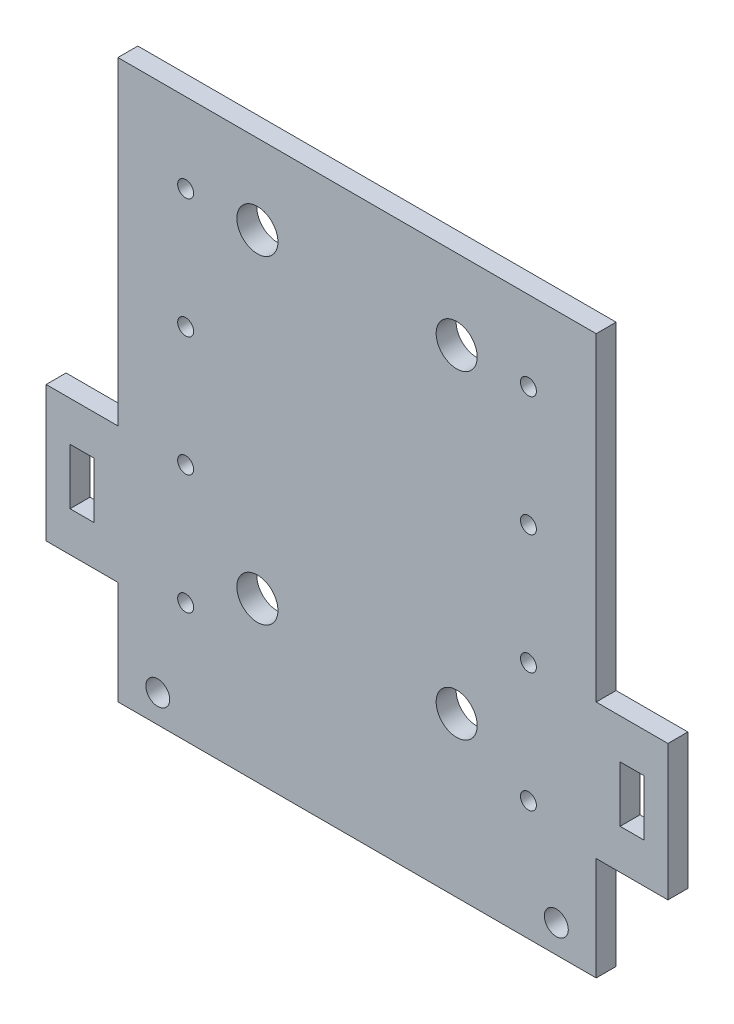
ISO-10303-21;
HEADER;
FILE_DESCRIPTION(('STEP AP214'),'2;1');
FILE_NAME('part.step','',(''),(''),'','','');
FILE_SCHEMA(('AUTOMOTIVE_DESIGN { 1 0 10303 214 1 1 1 1 }'));
ENDSEC;
DATA;
#1=APPLICATION_CONTEXT('core data for automotive mechanical design processes');
#2=APPLICATION_PROTOCOL_DEFINITION('international standard','automotive_design',2000,#1);
#3=PRODUCT_CONTEXT('',#1,'mechanical');
#4=PRODUCT('Part','Part','',(#3));
#5=PRODUCT_RELATED_PRODUCT_CATEGORY('part','',(#4));
#6=PRODUCT_DEFINITION_FORMATION('','',#4);
#7=PRODUCT_DEFINITION_CONTEXT('part definition',#1,'design');
#8=PRODUCT_DEFINITION('design','',#6,#7);
#9=PRODUCT_DEFINITION_SHAPE('','',#8);
#10=(LENGTH_UNIT() NAMED_UNIT(*) SI_UNIT(.MILLI.,.METRE.));
#11=(NAMED_UNIT(*) PLANE_ANGLE_UNIT() SI_UNIT($,.RADIAN.));
#12=(NAMED_UNIT(*) SI_UNIT($,.STERADIAN.) SOLID_ANGLE_UNIT());
#13=UNCERTAINTY_MEASURE_WITH_UNIT(LENGTH_MEASURE(1.E-05),#10,'distance_accuracy_value','');
#14=(GEOMETRIC_REPRESENTATION_CONTEXT(3) GLOBAL_UNCERTAINTY_ASSIGNED_CONTEXT((#13)) GLOBAL_UNIT_ASSIGNED_CONTEXT((#10,
#11,#12)) REPRESENTATION_CONTEXT('',''));
#15=CARTESIAN_POINT('',(0.,0.,0.));
#16=DIRECTION('',(0.,0.,1.));
#17=DIRECTION('',(1.,0.,0.));
#18=AXIS2_PLACEMENT_3D('',#15,#16,#17);
#19=CARTESIAN_POINT('',(-54.6061488794653,570.344470221386,0.));
#20=DIRECTION('',(0.,-1.,0.));
#21=DIRECTION('',(0.,0.,-1.));
#22=AXIS2_PLACEMENT_3D('',#19,#20,#21);
#23=PLANE('',#22);
#24=DIRECTION('',(1.,0.,0.));
#25=VECTOR('',#24,1.);
#26=CARTESIAN_POINT('',(-54.6061488794653,570.344470221386,0.));
#27=LINE('',#26,#25);
#28=CARTESIAN_POINT('',(-54.6061488794653,570.344470221386,0.));
#29=VERTEX_POINT('',#28);
#30=CARTESIAN_POINT('',(-45.6061488794653,570.344470221386,0.));
#31=VERTEX_POINT('',#30);
#32=EDGE_CURVE('E336',#29,#31,#27,.T.);
#33=ORIENTED_EDGE('',*,*,#32,.T.);
#34=DIRECTION('',(0.,0.,1.));
#35=VECTOR('',#34,1.);
#36=CARTESIAN_POINT('',(-45.6061488794653,570.344470221386,0.));
#37=LINE('',#36,#35);
#38=CARTESIAN_POINT('',(-45.6061488794653,570.344470221386,2.5));
#39=VERTEX_POINT('',#38);
#40=EDGE_CURVE('E11',#31,#39,#37,.T.);
#41=ORIENTED_EDGE('',*,*,#40,.T.);
#42=DIRECTION('',(1.,0.,0.));
#43=VECTOR('',#42,1.);
#44=CARTESIAN_POINT('',(-54.6061488794653,570.344470221386,2.5));
#45=LINE('',#44,#43);
#46=CARTESIAN_POINT('',(-54.6061488794653,570.344470221386,2.5));
#47=VERTEX_POINT('',#46);
#48=EDGE_CURVE('E355',#47,#39,#45,.T.);
#49=ORIENTED_EDGE('',*,*,#48,.F.);
#50=DIRECTION('',(0.,0.,1.));
#51=VECTOR('',#50,1.);
#52=CARTESIAN_POINT('',(-54.6061488794653,570.344470221386,0.));
#53=LINE('',#52,#51);
#54=EDGE_CURVE('E467',#29,#47,#53,.T.);
#55=ORIENTED_EDGE('',*,*,#54,.F.);
#56=EDGE_LOOP('',(#33,#41,#49,#55));
#57=FACE_BOUND('',#56,.T.);
#58=ADVANCED_FACE('F16',(#57),#23,.T.);
#59=CARTESIAN_POINT('',(-45.6061488794653,570.344470221386,0.));
#60=DIRECTION('',(1.,0.,0.));
#61=DIRECTION('',(0.,1.,0.));
#62=AXIS2_PLACEMENT_3D('',#59,#60,#61);
#63=PLANE('',#62);
#64=DIRECTION('',(0.,1.,0.));
#65=VECTOR('',#64,1.);
#66=CARTESIAN_POINT('',(-45.6061488794653,570.344470221386,0.));
#67=LINE('',#66,#65);
#68=CARTESIAN_POINT('',(-45.6061488794653,587.344470221386,0.));
#69=VERTEX_POINT('',#68);
#70=EDGE_CURVE('E345',#31,#69,#67,.T.);
#71=ORIENTED_EDGE('',*,*,#70,.T.);
#72=DIRECTION('',(0.,0.,1.));
#73=VECTOR('',#72,1.);
#74=CARTESIAN_POINT('',(-45.6061488794653,587.344470221386,0.));
#75=LINE('',#74,#73);
#76=CARTESIAN_POINT('',(-45.6061488794653,587.344470221386,2.5));
#77=VERTEX_POINT('',#76);
#78=EDGE_CURVE('E27',#69,#77,#75,.T.);
#79=ORIENTED_EDGE('',*,*,#78,.T.);
#80=DIRECTION('',(0.,1.,0.));
#81=VECTOR('',#80,1.);
#82=CARTESIAN_POINT('',(-45.6061488794653,570.344470221386,2.5));
#83=LINE('',#82,#81);
#84=EDGE_CURVE('E350',#39,#77,#83,.T.);
#85=ORIENTED_EDGE('',*,*,#84,.F.);
#86=ORIENTED_EDGE('',*,*,#40,.F.);
#87=EDGE_LOOP('',(#71,#79,#85,#86));
#88=FACE_BOUND('',#87,.T.);
#89=ADVANCED_FACE('F671',(#88),#63,.T.);
#90=CARTESIAN_POINT('',(-45.6061488794653,587.344470221386,0.));
#91=DIRECTION('',(0.,1.,0.));
#92=DIRECTION('',(1.,0.,0.));
#93=AXIS2_PLACEMENT_3D('',#90,#91,#92);
#94=PLANE('',#93);
#95=DIRECTION('',(-1.,0.,0.));
#96=VECTOR('',#95,1.);
#97=CARTESIAN_POINT('',(-45.6061488794653,587.344470221386,0.));
#98=LINE('',#97,#96);
#99=CARTESIAN_POINT('',(-54.6061488794653,587.344470221386,0.));
#100=VERTEX_POINT('',#99);
#101=EDGE_CURVE('E486',#69,#100,#98,.T.);
#102=ORIENTED_EDGE('',*,*,#101,.T.);
#103=DIRECTION('',(0.,0.,1.));
#104=VECTOR('',#103,1.);
#105=CARTESIAN_POINT('',(-54.6061488794653,587.344470221386,0.));
#106=LINE('',#105,#104);
#107=CARTESIAN_POINT('',(-54.6061488794653,587.344470221386,2.5));
#108=VERTEX_POINT('',#107);
#109=EDGE_CURVE('E375',#100,#108,#106,.T.);
#110=ORIENTED_EDGE('',*,*,#109,.T.);
#111=DIRECTION('',(-1.,0.,0.));
#112=VECTOR('',#111,1.);
#113=CARTESIAN_POINT('',(-45.6061488794653,587.344470221386,2.5));
#114=LINE('',#113,#112);
#115=EDGE_CURVE('E354',#77,#108,#114,.T.);
#116=ORIENTED_EDGE('',*,*,#115,.F.);
#117=ORIENTED_EDGE('',*,*,#78,.F.);
#118=EDGE_LOOP('',(#102,#110,#116,#117));
#119=FACE_BOUND('',#118,.T.);
#120=ADVANCED_FACE('F675',(#119),#94,.T.);
#121=CARTESIAN_POINT('',(-54.6061488794653,587.344470221386,0.));
#122=DIRECTION('',(1.,0.,0.));
#123=DIRECTION('',(0.,1.,0.));
#124=AXIS2_PLACEMENT_3D('',#121,#122,#123);
#125=PLANE('',#124);
#126=DIRECTION('',(0.,1.,0.));
#127=VECTOR('',#126,1.);
#128=CARTESIAN_POINT('',(-54.6061488794653,587.344470221386,0.));
#129=LINE('',#128,#127);
#130=CARTESIAN_POINT('',(-54.6061488794653,627.364470221386,0.));
#131=VERTEX_POINT('',#130);
#132=EDGE_CURVE('E482',#100,#131,#129,.T.);
#133=ORIENTED_EDGE('',*,*,#132,.T.);
#134=DIRECTION('',(0.,0.,1.));
#135=VECTOR('',#134,1.);
#136=CARTESIAN_POINT('',(-54.6061488794653,627.364470221386,0.));
#137=LINE('',#136,#135);
#138=CARTESIAN_POINT('',(-54.6061488794653,627.364470221386,2.5));
#139=VERTEX_POINT('',#138);
#140=EDGE_CURVE('E372',#131,#139,#137,.T.);
#141=ORIENTED_EDGE('',*,*,#140,.T.);
#142=DIRECTION('',(0.,1.,0.));
#143=VECTOR('',#142,1.);
#144=CARTESIAN_POINT('',(-54.6061488794653,587.344470221386,2.5));
#145=LINE('',#144,#143);
#146=EDGE_CURVE('E367',#108,#139,#145,.T.);
#147=ORIENTED_EDGE('',*,*,#146,.F.);
#148=ORIENTED_EDGE('',*,*,#109,.F.);
#149=EDGE_LOOP('',(#133,#141,#147,#148));
#150=FACE_BOUND('',#149,.T.);
#151=ADVANCED_FACE('F679',(#150),#125,.T.);
#152=CARTESIAN_POINT('',(-54.6061488794653,627.364470221386,0.));
#153=DIRECTION('',(0.,1.,0.));
#154=DIRECTION('',(1.,0.,0.));
#155=AXIS2_PLACEMENT_3D('',#152,#153,#154);
#156=PLANE('',#155);
#157=DIRECTION('',(-1.,0.,0.));
#158=VECTOR('',#157,1.);
#159=CARTESIAN_POINT('',(-54.6061488794653,627.364470221386,0.));
#160=LINE('',#159,#158);
#161=CARTESIAN_POINT('',(-114.606148879465,627.364470221386,0.));
#162=VERTEX_POINT('',#161);
#163=EDGE_CURVE('E487',#131,#162,#160,.T.);
#164=ORIENTED_EDGE('',*,*,#163,.T.);
#165=DIRECTION('',(0.,0.,1.));
#166=VECTOR('',#165,1.);
#167=CARTESIAN_POINT('',(-114.606148879465,627.364470221386,0.));
#168=LINE('',#167,#166);
#169=CARTESIAN_POINT('',(-114.606148879465,627.364470221386,2.5));
#170=VERTEX_POINT('',#169);
#171=EDGE_CURVE('E376',#162,#170,#168,.T.);
#172=ORIENTED_EDGE('',*,*,#171,.T.);
#173=DIRECTION('',(-1.,0.,0.));
#174=VECTOR('',#173,1.);
#175=CARTESIAN_POINT('',(-54.6061488794653,627.364470221386,2.5));
#176=LINE('',#175,#174);
#177=EDGE_CURVE('E370',#139,#170,#176,.T.);
#178=ORIENTED_EDGE('',*,*,#177,.F.);
#179=ORIENTED_EDGE('',*,*,#140,.F.);
#180=EDGE_LOOP('',(#164,#172,#178,#179));
#181=FACE_BOUND('',#180,.T.);
#182=ADVANCED_FACE('F683',(#181),#156,.T.);
#183=CARTESIAN_POINT('',(-114.606148879465,627.364470221386,0.));
#184=DIRECTION('',(-1.,0.,0.));
#185=DIRECTION('',(0.,0.,1.));
#186=AXIS2_PLACEMENT_3D('',#183,#184,#185);
#187=PLANE('',#186);
#188=DIRECTION('',(0.,-1.,0.));
#189=VECTOR('',#188,1.);
#190=CARTESIAN_POINT('',(-114.606148879465,627.364470221386,0.));
#191=LINE('',#190,#189);
#192=CARTESIAN_POINT('',(-114.606148879465,587.344470221386,0.));
#193=VERTEX_POINT('',#192);
#194=EDGE_CURVE('E427',#162,#193,#191,.T.);
#195=ORIENTED_EDGE('',*,*,#194,.T.);
#196=DIRECTION('',(0.,0.,1.));
#197=VECTOR('',#196,1.);
#198=CARTESIAN_POINT('',(-114.606148879465,587.344470221386,0.));
#199=LINE('',#198,#197);
#200=CARTESIAN_POINT('',(-114.606148879465,587.344470221386,2.5));
#201=VERTEX_POINT('',#200);
#202=EDGE_CURVE('E418',#193,#201,#199,.T.);
#203=ORIENTED_EDGE('',*,*,#202,.T.);
#204=DIRECTION('',(0.,-1.,0.));
#205=VECTOR('',#204,1.);
#206=CARTESIAN_POINT('',(-114.606148879465,627.364470221386,2.5));
#207=LINE('',#206,#205);
#208=EDGE_CURVE('E395',#170,#201,#207,.T.);
#209=ORIENTED_EDGE('',*,*,#208,.F.);
#210=ORIENTED_EDGE('',*,*,#171,.F.);
#211=EDGE_LOOP('',(#195,#203,#209,#210));
#212=FACE_BOUND('',#211,.T.);
#213=ADVANCED_FACE('F687',(#212),#187,.T.);
#214=CARTESIAN_POINT('',(-114.606148879465,587.344470221386,0.));
#215=DIRECTION('',(0.,1.,0.));
#216=DIRECTION('',(1.,0.,0.));
#217=AXIS2_PLACEMENT_3D('',#214,#215,#216);
#218=PLANE('',#217);
#219=DIRECTION('',(-1.,0.,0.));
#220=VECTOR('',#219,1.);
#221=CARTESIAN_POINT('',(-114.606148879465,587.344470221386,0.));
#222=LINE('',#221,#220);
#223=CARTESIAN_POINT('',(-123.606148879465,587.344470221386,0.));
#224=VERTEX_POINT('',#223);
#225=EDGE_CURVE('E423',#193,#224,#222,.T.);
#226=ORIENTED_EDGE('',*,*,#225,.T.);
#227=DIRECTION('',(0.,0.,1.));
#228=VECTOR('',#227,1.);
#229=CARTESIAN_POINT('',(-123.606148879465,587.344470221386,0.));
#230=LINE('',#229,#228);
#231=CARTESIAN_POINT('',(-123.606148879465,587.344470221386,2.5));
#232=VERTEX_POINT('',#231);
#233=EDGE_CURVE('E522',#224,#232,#230,.T.);
#234=ORIENTED_EDGE('',*,*,#233,.T.);
#235=DIRECTION('',(-1.,0.,0.));
#236=VECTOR('',#235,1.);
#237=CARTESIAN_POINT('',(-114.606148879465,587.344470221386,2.5));
#238=LINE('',#237,#236);
#239=EDGE_CURVE('E478',#201,#232,#238,.T.);
#240=ORIENTED_EDGE('',*,*,#239,.F.);
#241=ORIENTED_EDGE('',*,*,#202,.F.);
#242=EDGE_LOOP('',(#226,#234,#240,#241));
#243=FACE_BOUND('',#242,.T.);
#244=ADVANCED_FACE('F693',(#243),#218,.T.);
#245=CARTESIAN_POINT('',(-123.606148879465,587.344470221386,0.));
#246=DIRECTION('',(-1.,0.,0.));
#247=DIRECTION('',(0.,0.,1.));
#248=AXIS2_PLACEMENT_3D('',#245,#246,#247);
#249=PLANE('',#248);
#250=DIRECTION('',(0.,-1.,0.));
#251=VECTOR('',#250,1.);
#252=CARTESIAN_POINT('',(-123.606148879465,587.344470221386,0.));
#253=LINE('',#252,#251);
#254=CARTESIAN_POINT('',(-123.606148879465,570.344470221386,0.));
#255=VERTEX_POINT('',#254);
#256=EDGE_CURVE('E428',#224,#255,#253,.T.);
#257=ORIENTED_EDGE('',*,*,#256,.T.);
#258=DIRECTION('',(0.,0.,1.));
#259=VECTOR('',#258,1.);
#260=CARTESIAN_POINT('',(-123.606148879465,570.344470221386,0.));
#261=LINE('',#260,#259);
#262=CARTESIAN_POINT('',(-123.606148879465,570.344470221386,2.5));
#263=VERTEX_POINT('',#262);
#264=EDGE_CURVE('E414',#255,#263,#261,.T.);
#265=ORIENTED_EDGE('',*,*,#264,.T.);
#266=DIRECTION('',(0.,-1.,0.));
#267=VECTOR('',#266,1.);
#268=CARTESIAN_POINT('',(-123.606148879465,587.344470221386,2.5));
#269=LINE('',#268,#267);
#270=EDGE_CURVE('E20',#232,#263,#269,.T.);
#271=ORIENTED_EDGE('',*,*,#270,.F.);
#272=ORIENTED_EDGE('',*,*,#233,.F.);
#273=EDGE_LOOP('',(#257,#265,#271,#272));
#274=FACE_BOUND('',#273,.T.);
#275=ADVANCED_FACE('F697',(#274),#249,.T.);
#276=CARTESIAN_POINT('',(-123.606148879465,570.344470221386,0.));
#277=DIRECTION('',(0.,-1.,0.));
#278=DIRECTION('',(0.,0.,-1.));
#279=AXIS2_PLACEMENT_3D('',#276,#277,#278);
#280=PLANE('',#279);
#281=DIRECTION('',(1.,0.,0.));
#282=VECTOR('',#281,1.);
#283=CARTESIAN_POINT('',(-123.606148879465,570.344470221386,0.));
#284=LINE('',#283,#282);
#285=CARTESIAN_POINT('',(-114.606148879465,570.344470221386,0.));
#286=VERTEX_POINT('',#285);
#287=EDGE_CURVE('E590',#255,#286,#284,.T.);
#288=ORIENTED_EDGE('',*,*,#287,.T.);
#289=DIRECTION('',(0.,0.,1.));
#290=VECTOR('',#289,1.);
#291=CARTESIAN_POINT('',(-114.606148879465,570.344470221386,0.));
#292=LINE('',#291,#290);
#293=CARTESIAN_POINT('',(-114.606148879465,570.344470221386,2.5));
#294=VERTEX_POINT('',#293);
#295=EDGE_CURVE('E411',#286,#294,#292,.T.);
#296=ORIENTED_EDGE('',*,*,#295,.T.);
#297=DIRECTION('',(1.,0.,0.));
#298=VECTOR('',#297,1.);
#299=CARTESIAN_POINT('',(-123.606148879465,570.344470221386,2.5));
#300=LINE('',#299,#298);
#301=EDGE_CURVE('E610',#263,#294,#300,.T.);
#302=ORIENTED_EDGE('',*,*,#301,.F.);
#303=ORIENTED_EDGE('',*,*,#264,.F.);
#304=EDGE_LOOP('',(#288,#296,#302,#303));
#305=FACE_BOUND('',#304,.T.);
#306=ADVANCED_FACE('F708',(#305),#280,.T.);
#307=CARTESIAN_POINT('',(-114.606148879465,570.344470221386,0.));
#308=DIRECTION('',(-1.,0.,0.));
#309=DIRECTION('',(0.,0.,1.));
#310=AXIS2_PLACEMENT_3D('',#307,#308,#309);
#311=PLANE('',#310);
#312=DIRECTION('',(0.,-1.,0.));
#313=VECTOR('',#312,1.);
#314=CARTESIAN_POINT('',(-114.606148879465,570.344470221386,0.));
#315=LINE('',#314,#313);
#316=CARTESIAN_POINT('',(-114.606148879465,557.364470221386,0.));
#317=VERTEX_POINT('',#316);
#318=EDGE_CURVE('E365',#286,#317,#315,.T.);
#319=ORIENTED_EDGE('',*,*,#318,.T.);
#320=DIRECTION('',(0.,0.,1.));
#321=VECTOR('',#320,1.);
#322=CARTESIAN_POINT('',(-114.606148879465,557.364470221386,0.));
#323=LINE('',#322,#321);
#324=CARTESIAN_POINT('',(-114.606148879465,557.364470221386,2.5));
#325=VERTEX_POINT('',#324);
#326=EDGE_CURVE('E415',#317,#325,#323,.T.);
#327=ORIENTED_EDGE('',*,*,#326,.T.);
#328=DIRECTION('',(0.,-1.,0.));
#329=VECTOR('',#328,1.);
#330=CARTESIAN_POINT('',(-114.606148879465,570.344470221386,2.5));
#331=LINE('',#330,#329);
#332=EDGE_CURVE('E574',#294,#325,#331,.T.);
#333=ORIENTED_EDGE('',*,*,#332,.F.);
#334=ORIENTED_EDGE('',*,*,#295,.F.);
#335=EDGE_LOOP('',(#319,#327,#333,#334));
#336=FACE_BOUND('',#335,.T.);
#337=ADVANCED_FACE('F713',(#336),#311,.T.);
#338=CARTESIAN_POINT('',(-114.606148879465,557.364470221386,0.));
#339=DIRECTION('',(0.,-1.,0.));
#340=DIRECTION('',(0.,0.,-1.));
#341=AXIS2_PLACEMENT_3D('',#338,#339,#340);
#342=PLANE('',#341);
#343=DIRECTION('',(1.,0.,0.));
#344=VECTOR('',#343,1.);
#345=CARTESIAN_POINT('',(-114.606148879465,557.364470221386,0.));
#346=LINE('',#345,#344);
#347=CARTESIAN_POINT('',(-54.6061488794653,557.364470221386,0.));
#348=VERTEX_POINT('',#347);
#349=EDGE_CURVE('E361',#317,#348,#346,.T.);
#350=ORIENTED_EDGE('',*,*,#349,.T.);
#351=DIRECTION('',(0.,0.,1.));
#352=VECTOR('',#351,1.);
#353=CARTESIAN_POINT('',(-54.6061488794653,557.364470221386,0.));
#354=LINE('',#353,#352);
#355=CARTESIAN_POINT('',(-54.6061488794653,557.364470221386,2.5));
#356=VERTEX_POINT('',#355);
#357=EDGE_CURVE('E464',#348,#356,#354,.T.);
#358=ORIENTED_EDGE('',*,*,#357,.T.);
#359=DIRECTION('',(1.,0.,0.));
#360=VECTOR('',#359,1.);
#361=CARTESIAN_POINT('',(-114.606148879465,557.364470221386,2.5));
#362=LINE('',#361,#360);
#363=EDGE_CURVE('E491',#325,#356,#362,.T.);
#364=ORIENTED_EDGE('',*,*,#363,.F.);
#365=ORIENTED_EDGE('',*,*,#326,.F.);
#366=EDGE_LOOP('',(#350,#358,#364,#365));
#367=FACE_BOUND('',#366,.T.);
#368=ADVANCED_FACE('F717',(#367),#342,.T.);
#369=CARTESIAN_POINT('',(-54.6061488794653,557.364470221386,0.));
#370=DIRECTION('',(1.,0.,0.));
#371=DIRECTION('',(0.,1.,0.));
#372=AXIS2_PLACEMENT_3D('',#369,#370,#371);
#373=PLANE('',#372);
#374=DIRECTION('',(0.,1.,0.));
#375=VECTOR('',#374,1.);
#376=CARTESIAN_POINT('',(-54.6061488794653,557.364470221386,0.));
#377=LINE('',#376,#375);
#378=EDGE_CURVE('E366',#348,#29,#377,.T.);
#379=ORIENTED_EDGE('',*,*,#378,.T.);
#380=ORIENTED_EDGE('',*,*,#54,.T.);
#381=DIRECTION('',(0.,1.,0.));
#382=VECTOR('',#381,1.);
#383=CARTESIAN_POINT('',(-54.6061488794653,557.364470221386,2.5));
#384=LINE('',#383,#382);
#385=EDGE_CURVE('E422',#356,#47,#384,.T.);
#386=ORIENTED_EDGE('',*,*,#385,.F.);
#387=ORIENTED_EDGE('',*,*,#357,.F.);
#388=EDGE_LOOP('',(#379,#380,#386,#387));
#389=FACE_BOUND('',#388,.T.);
#390=ADVANCED_FACE('F720',(#389),#373,.T.);
#391=CARTESIAN_POINT('',(-51.6061488794653,575.344470221386,0.));
#392=DIRECTION('',(0.,-1.,0.));
#393=DIRECTION('',(0.,0.,-1.));
#394=AXIS2_PLACEMENT_3D('',#391,#392,#393);
#395=PLANE('',#394);
#396=DIRECTION('',(-1.,0.,0.));
#397=VECTOR('',#396,1.);
#398=CARTESIAN_POINT('',(-51.6061488794653,575.344470221386,2.5));
#399=LINE('',#398,#397);
#400=CARTESIAN_POINT('',(-48.6061488794653,575.344470221386,2.5));
#401=VERTEX_POINT('',#400);
#402=CARTESIAN_POINT('',(-51.6061488794653,575.344470221386,2.5));
#403=VERTEX_POINT('',#402);
#404=EDGE_CURVE('E419',#401,#403,#399,.T.);
#405=ORIENTED_EDGE('',*,*,#404,.F.);
#406=DIRECTION('',(0.,0.,1.));
#407=VECTOR('',#406,1.);
#408=CARTESIAN_POINT('',(-48.6061488794653,575.344470221386,0.));
#409=LINE('',#408,#407);
#410=CARTESIAN_POINT('',(-48.6061488794653,575.344470221386,0.));
#411=VERTEX_POINT('',#410);
#412=EDGE_CURVE('E332',#411,#401,#409,.T.);
#413=ORIENTED_EDGE('',*,*,#412,.F.);
#414=DIRECTION('',(1.,0.,0.));
#415=VECTOR('',#414,1.);
#416=CARTESIAN_POINT('',(-51.6061488794653,575.344470221386,0.));
#417=LINE('',#416,#415);
#418=CARTESIAN_POINT('',(-51.6061488794653,575.344470221386,0.));
#419=VERTEX_POINT('',#418);
#420=EDGE_CURVE('E325',#419,#411,#417,.T.);
#421=ORIENTED_EDGE('',*,*,#420,.F.);
#422=DIRECTION('',(0.,0.,1.));
#423=VECTOR('',#422,1.);
#424=CARTESIAN_POINT('',(-51.6061488794653,575.344470221386,0.));
#425=LINE('',#424,#423);
#426=EDGE_CURVE('E306',#419,#403,#425,.T.);
#427=ORIENTED_EDGE('',*,*,#426,.T.);
#428=EDGE_LOOP('',(#405,#413,#421,#427));
#429=FACE_BOUND('',#428,.T.);
#430=ADVANCED_FACE('F331',(#429),#395,.F.);
#431=CARTESIAN_POINT('',(-48.6061488794653,575.344470221386,0.));
#432=DIRECTION('',(1.,0.,0.));
#433=DIRECTION('',(0.,1.,0.));
#434=AXIS2_PLACEMENT_3D('',#431,#432,#433);
#435=PLANE('',#434);
#436=DIRECTION('',(0.,-1.,0.));
#437=VECTOR('',#436,1.);
#438=CARTESIAN_POINT('',(-48.6061488794653,575.344470221386,2.5));
#439=LINE('',#438,#437);
#440=CARTESIAN_POINT('',(-48.6061488794653,582.344470221386,2.5));
#441=VERTEX_POINT('',#440);
#442=EDGE_CURVE('E386',#441,#401,#439,.T.);
#443=ORIENTED_EDGE('',*,*,#442,.F.);
#444=DIRECTION('',(0.,0.,1.));
#445=VECTOR('',#444,1.);
#446=CARTESIAN_POINT('',(-48.6061488794653,582.344470221386,0.));
#447=LINE('',#446,#445);
#448=CARTESIAN_POINT('',(-48.6061488794653,582.344470221386,0.));
#449=VERTEX_POINT('',#448);
#450=EDGE_CURVE('E458',#449,#441,#447,.T.);
#451=ORIENTED_EDGE('',*,*,#450,.F.);
#452=DIRECTION('',(0.,1.,0.));
#453=VECTOR('',#452,1.);
#454=CARTESIAN_POINT('',(-48.6061488794653,575.344470221386,0.));
#455=LINE('',#454,#453);
#456=EDGE_CURVE('E335',#411,#449,#455,.T.);
#457=ORIENTED_EDGE('',*,*,#456,.F.);
#458=ORIENTED_EDGE('',*,*,#412,.T.);
#459=EDGE_LOOP('',(#443,#451,#457,#458));
#460=FACE_BOUND('',#459,.T.);
#461=ADVANCED_FACE('F1088',(#460),#435,.F.);
#462=CARTESIAN_POINT('',(-48.6061488794653,582.344470221386,0.));
#463=DIRECTION('',(0.,1.,0.));
#464=DIRECTION('',(1.,0.,0.));
#465=AXIS2_PLACEMENT_3D('',#462,#463,#464);
#466=PLANE('',#465);
#467=DIRECTION('',(1.,0.,0.));
#468=VECTOR('',#467,1.);
#469=CARTESIAN_POINT('',(-48.6061488794653,582.344470221386,2.5));
#470=LINE('',#469,#468);
#471=CARTESIAN_POINT('',(-51.6061488794653,582.344470221386,2.5));
#472=VERTEX_POINT('',#471);
#473=EDGE_CURVE('E382',#472,#441,#470,.T.);
#474=ORIENTED_EDGE('',*,*,#473,.F.);
#475=DIRECTION('',(0.,0.,1.));
#476=VECTOR('',#475,1.);
#477=CARTESIAN_POINT('',(-51.6061488794653,582.344470221386,0.));
#478=LINE('',#477,#476);
#479=CARTESIAN_POINT('',(-51.6061488794653,582.344470221386,0.));
#480=VERTEX_POINT('',#479);
#481=EDGE_CURVE('E317',#480,#472,#478,.T.);
#482=ORIENTED_EDGE('',*,*,#481,.F.);
#483=DIRECTION('',(-1.,0.,0.));
#484=VECTOR('',#483,1.);
#485=CARTESIAN_POINT('',(-48.6061488794653,582.344470221386,0.));
#486=LINE('',#485,#484);
#487=EDGE_CURVE('E327',#449,#480,#486,.T.);
#488=ORIENTED_EDGE('',*,*,#487,.F.);
#489=ORIENTED_EDGE('',*,*,#450,.T.);
#490=EDGE_LOOP('',(#474,#482,#488,#489));
#491=FACE_BOUND('',#490,.T.);
#492=ADVANCED_FACE('F1083',(#491),#466,.F.);
#493=CARTESIAN_POINT('',(-51.6061488794653,582.344470221386,0.));
#494=DIRECTION('',(-1.,0.,0.));
#495=DIRECTION('',(0.,0.,1.));
#496=AXIS2_PLACEMENT_3D('',#493,#494,#495);
#497=PLANE('',#496);
#498=DIRECTION('',(0.,1.,0.));
#499=VECTOR('',#498,1.);
#500=CARTESIAN_POINT('',(-51.6061488794653,582.344470221386,2.5));
#501=LINE('',#500,#499);
#502=EDGE_CURVE('E311',#403,#472,#501,.T.);
#503=ORIENTED_EDGE('',*,*,#502,.F.);
#504=ORIENTED_EDGE('',*,*,#426,.F.);
#505=DIRECTION('',(0.,-1.,0.));
#506=VECTOR('',#505,1.);
#507=CARTESIAN_POINT('',(-51.6061488794653,582.344470221386,0.));
#508=LINE('',#507,#506);
#509=EDGE_CURVE('E308',#480,#419,#508,.T.);
#510=ORIENTED_EDGE('',*,*,#509,.F.);
#511=ORIENTED_EDGE('',*,*,#481,.T.);
#512=EDGE_LOOP('',(#503,#504,#510,#511));
#513=FACE_BOUND('',#512,.T.);
#514=ADVANCED_FACE('F18',(#513),#497,.F.);
#515=CARTESIAN_POINT('',(-117.606148879465,575.344470221386,0.));
#516=DIRECTION('',(1.,0.,0.));
#517=DIRECTION('',(0.,1.,0.));
#518=AXIS2_PLACEMENT_3D('',#515,#516,#517);
#519=PLANE('',#518);
#520=DIRECTION('',(0.,-1.,0.));
#521=VECTOR('',#520,1.);
#522=CARTESIAN_POINT('',(-117.606148879465,575.344470221386,2.5));
#523=LINE('',#522,#521);
#524=CARTESIAN_POINT('',(-117.606148879465,582.344470221386,2.5));
#525=VERTEX_POINT('',#524);
#526=CARTESIAN_POINT('',(-117.606148879465,575.344470221386,2.5));
#527=VERTEX_POINT('',#526);
#528=EDGE_CURVE('E510',#525,#527,#523,.T.);
#529=ORIENTED_EDGE('',*,*,#528,.F.);
#530=DIRECTION('',(0.,0.,1.));
#531=VECTOR('',#530,1.);
#532=CARTESIAN_POINT('',(-117.606148879465,582.344470221386,0.));
#533=LINE('',#532,#531);
#534=CARTESIAN_POINT('',(-117.606148879465,582.344470221386,0.));
#535=VERTEX_POINT('',#534);
#536=EDGE_CURVE('E318',#535,#525,#533,.T.);
#537=ORIENTED_EDGE('',*,*,#536,.F.);
#538=DIRECTION('',(0.,1.,0.));
#539=VECTOR('',#538,1.);
#540=CARTESIAN_POINT('',(-117.606148879465,575.344470221386,0.));
#541=LINE('',#540,#539);
#542=CARTESIAN_POINT('',(-117.606148879465,575.344470221386,0.));
#543=VERTEX_POINT('',#542);
#544=EDGE_CURVE('E329',#543,#535,#541,.T.);
#545=ORIENTED_EDGE('',*,*,#544,.F.);
#546=DIRECTION('',(0.,0.,1.));
#547=VECTOR('',#546,1.);
#548=CARTESIAN_POINT('',(-117.606148879465,575.344470221386,0.));
#549=LINE('',#548,#547);
#550=EDGE_CURVE('E513',#543,#527,#549,.T.);
#551=ORIENTED_EDGE('',*,*,#550,.T.);
#552=EDGE_LOOP('',(#529,#537,#545,#551));
#553=FACE_BOUND('',#552,.T.);
#554=ADVANCED_FACE('F652',(#553),#519,.F.);
#555=CARTESIAN_POINT('',(-117.606148879465,582.344470221386,0.));
#556=DIRECTION('',(0.,1.,0.));
#557=DIRECTION('',(1.,0.,0.));
#558=AXIS2_PLACEMENT_3D('',#555,#556,#557);
#559=PLANE('',#558);
#560=DIRECTION('',(1.,0.,0.));
#561=VECTOR('',#560,1.);
#562=CARTESIAN_POINT('',(-117.606148879465,582.344470221386,2.5));
#563=LINE('',#562,#561);
#564=CARTESIAN_POINT('',(-120.606148879465,582.344470221386,2.5));
#565=VERTEX_POINT('',#564);
#566=EDGE_CURVE('E400',#565,#525,#563,.T.);
#567=ORIENTED_EDGE('',*,*,#566,.F.);
#568=DIRECTION('',(0.,0.,1.));
#569=VECTOR('',#568,1.);
#570=CARTESIAN_POINT('',(-120.606148879465,582.344470221386,0.));
#571=LINE('',#570,#569);
#572=CARTESIAN_POINT('',(-120.606148879465,582.344470221386,0.));
#573=VERTEX_POINT('',#572);
#574=EDGE_CURVE('E379',#573,#565,#571,.T.);
#575=ORIENTED_EDGE('',*,*,#574,.F.);
#576=DIRECTION('',(-1.,0.,0.));
#577=VECTOR('',#576,1.);
#578=CARTESIAN_POINT('',(-117.606148879465,582.344470221386,0.));
#579=LINE('',#578,#577);
#580=EDGE_CURVE('E434',#535,#573,#579,.T.);
#581=ORIENTED_EDGE('',*,*,#580,.F.);
#582=ORIENTED_EDGE('',*,*,#536,.T.);
#583=EDGE_LOOP('',(#567,#575,#581,#582));
#584=FACE_BOUND('',#583,.T.);
#585=ADVANCED_FACE('F654',(#584),#559,.F.);
#586=CARTESIAN_POINT('',(-120.606148879465,582.344470221386,0.));
#587=DIRECTION('',(-1.,0.,0.));
#588=DIRECTION('',(0.,0.,1.));
#589=AXIS2_PLACEMENT_3D('',#586,#587,#588);
#590=PLANE('',#589);
#591=DIRECTION('',(0.,1.,0.));
#592=VECTOR('',#591,1.);
#593=CARTESIAN_POINT('',(-120.606148879465,582.344470221386,2.5));
#594=LINE('',#593,#592);
#595=CARTESIAN_POINT('',(-120.606148879465,575.344470221386,2.5));
#596=VERTEX_POINT('',#595);
#597=EDGE_CURVE('E459',#596,#565,#594,.T.);
#598=ORIENTED_EDGE('',*,*,#597,.F.);
#599=DIRECTION('',(0.,0.,1.));
#600=VECTOR('',#599,1.);
#601=CARTESIAN_POINT('',(-120.606148879465,575.344470221386,0.));
#602=LINE('',#601,#600);
#603=CARTESIAN_POINT('',(-120.606148879465,575.344470221386,0.));
#604=VERTEX_POINT('',#603);
#605=EDGE_CURVE('E539',#604,#596,#602,.T.);
#606=ORIENTED_EDGE('',*,*,#605,.F.);
#607=DIRECTION('',(0.,-1.,0.));
#608=VECTOR('',#607,1.);
#609=CARTESIAN_POINT('',(-120.606148879465,582.344470221386,0.));
#610=LINE('',#609,#608);
#611=EDGE_CURVE('E435',#573,#604,#610,.T.);
#612=ORIENTED_EDGE('',*,*,#611,.F.);
#613=ORIENTED_EDGE('',*,*,#574,.T.);
#614=EDGE_LOOP('',(#598,#606,#612,#613));
#615=FACE_BOUND('',#614,.T.);
#616=ADVANCED_FACE('F655',(#615),#590,.F.);
#617=CARTESIAN_POINT('',(-120.606148879465,575.344470221386,0.));
#618=DIRECTION('',(0.,-1.,0.));
#619=DIRECTION('',(0.,0.,-1.));
#620=AXIS2_PLACEMENT_3D('',#617,#618,#619);
#621=PLANE('',#620);
#622=DIRECTION('',(-1.,0.,0.));
#623=VECTOR('',#622,1.);
#624=CARTESIAN_POINT('',(-120.606148879465,575.344470221386,2.5));
#625=LINE('',#624,#623);
#626=EDGE_CURVE('E462',#527,#596,#625,.T.);
#627=ORIENTED_EDGE('',*,*,#626,.F.);
#628=ORIENTED_EDGE('',*,*,#550,.F.);
#629=DIRECTION('',(1.,0.,0.));
#630=VECTOR('',#629,1.);
#631=CARTESIAN_POINT('',(-120.606148879465,575.344470221386,0.));
#632=LINE('',#631,#630);
#633=EDGE_CURVE('E438',#604,#543,#632,.T.);
#634=ORIENTED_EDGE('',*,*,#633,.F.);
#635=ORIENTED_EDGE('',*,*,#605,.T.);
#636=EDGE_LOOP('',(#627,#628,#634,#635));
#637=FACE_BOUND('',#636,.T.);
#638=ADVANCED_FACE('F656',(#637),#621,.F.);
#639=CARTESIAN_POINT('',(-97.1061488794653,577.324469632819,0.));
#640=DIRECTION('',(0.,0.,1.));
#641=DIRECTION('',(1.,0.,0.));
#642=AXIS2_PLACEMENT_3D('',#639,#640,#641);
#643=CYLINDRICAL_SURFACE('',#642,2.575);
#644=CARTESIAN_POINT('',(-97.1061488794653,577.324469632819,2.5));
#645=DIRECTION('',(0.,0.,-1.));
#646=DIRECTION('',(1.,0.,0.));
#647=AXIS2_PLACEMENT_3D('',#644,#645,#646);
#648=CIRCLE('',#647,2.575);
#649=CARTESIAN_POINT('',(-94.5311488794653,577.324469632819,2.5));
#650=VERTEX_POINT('',#649);
#651=EDGE_CURVE('E396',#650,#650,#648,.T.);
#652=ORIENTED_EDGE('',*,*,#651,.F.);
#653=EDGE_LOOP('',(#652));
#654=FACE_BOUND('',#653,.T.);
#655=CARTESIAN_POINT('',(-97.1061488794653,577.324469632819,0.));
#656=DIRECTION('',(0.,0.,1.));
#657=DIRECTION('',(1.,0.,0.));
#658=AXIS2_PLACEMENT_3D('',#655,#656,#657);
#659=CIRCLE('',#658,2.575);
#660=CARTESIAN_POINT('',(-94.5311488794653,577.324469632819,0.));
#661=VERTEX_POINT('',#660);
#662=EDGE_CURVE('E447',#661,#661,#659,.T.);
#663=ORIENTED_EDGE('',*,*,#662,.F.);
#664=EDGE_LOOP('',(#663));
#665=FACE_BOUND('',#664,.T.);
#666=ADVANCED_FACE('F886',(#654,#665),#643,.F.);
#667=CARTESIAN_POINT('',(-72.1061488794653,577.324469491134,0.));
#668=DIRECTION('',(0.,0.,1.));
#669=DIRECTION('',(1.,0.,0.));
#670=AXIS2_PLACEMENT_3D('',#667,#668,#669);
#671=CYLINDRICAL_SURFACE('',#670,2.575);
#672=CARTESIAN_POINT('',(-72.1061488794653,577.324469491134,2.5));
#673=DIRECTION('',(0.,0.,-1.));
#674=DIRECTION('',(1.,0.,0.));
#675=AXIS2_PLACEMENT_3D('',#672,#673,#674);
#676=CIRCLE('',#675,2.575);
#677=CARTESIAN_POINT('',(-69.5311488794653,577.324469491134,2.5));
#678=VERTEX_POINT('',#677);
#679=EDGE_CURVE('E399',#678,#678,#676,.T.);
#680=ORIENTED_EDGE('',*,*,#679,.F.);
#681=EDGE_LOOP('',(#680));
#682=FACE_BOUND('',#681,.T.);
#683=CARTESIAN_POINT('',(-72.1061488794653,577.324469491134,0.));
#684=DIRECTION('',(0.,0.,1.));
#685=DIRECTION('',(1.,0.,0.));
#686=AXIS2_PLACEMENT_3D('',#683,#684,#685);
#687=CIRCLE('',#686,2.575);
#688=CARTESIAN_POINT('',(-69.5311488794653,577.324469491134,0.));
#689=VERTEX_POINT('',#688);
#690=EDGE_CURVE('E582',#689,#689,#687,.T.);
#691=ORIENTED_EDGE('',*,*,#690,.F.);
#692=EDGE_LOOP('',(#691));
#693=FACE_BOUND('',#692,.T.);
#694=ADVANCED_FACE('F1023',(#682,#693),#671,.F.);
#695=CARTESIAN_POINT('',(-72.1061488794653,617.364470221386,0.));
#696=DIRECTION('',(0.,0.,1.));
#697=DIRECTION('',(1.,0.,0.));
#698=AXIS2_PLACEMENT_3D('',#695,#696,#697);
#699=CYLINDRICAL_SURFACE('',#698,2.575);
#700=CARTESIAN_POINT('',(-72.1061488794653,617.364470221386,2.5));
#701=DIRECTION('',(0.,0.,-1.));
#702=DIRECTION('',(1.,0.,0.));
#703=AXIS2_PLACEMENT_3D('',#700,#701,#702);
#704=CIRCLE('',#703,2.575);
#705=CARTESIAN_POINT('',(-69.5311488794653,617.364470221386,2.5));
#706=VERTEX_POINT('',#705);
#707=EDGE_CURVE('E496',#706,#706,#704,.T.);
#708=ORIENTED_EDGE('',*,*,#707,.F.);
#709=EDGE_LOOP('',(#708));
#710=FACE_BOUND('',#709,.T.);
#711=CARTESIAN_POINT('',(-72.1061488794653,617.364470221386,0.));
#712=DIRECTION('',(0.,0.,1.));
#713=DIRECTION('',(1.,0.,0.));
#714=AXIS2_PLACEMENT_3D('',#711,#712,#713);
#715=CIRCLE('',#714,2.575);
#716=CARTESIAN_POINT('',(-69.5311488794653,617.364470221386,0.));
#717=VERTEX_POINT('',#716);
#718=EDGE_CURVE('E585',#717,#717,#715,.T.);
#719=ORIENTED_EDGE('',*,*,#718,.F.);
#720=EDGE_LOOP('',(#719));
#721=FACE_BOUND('',#720,.T.);
#722=ADVANCED_FACE('F1014',(#710,#721),#699,.F.);
#723=CARTESIAN_POINT('',(-97.1061488794653,617.364470221386,0.));
#724=DIRECTION('',(0.,0.,1.));
#725=DIRECTION('',(1.,0.,0.));
#726=AXIS2_PLACEMENT_3D('',#723,#724,#725);
#727=CYLINDRICAL_SURFACE('',#726,2.575);
#728=CARTESIAN_POINT('',(-97.1061488794653,617.364470221386,2.5));
#729=DIRECTION('',(0.,0.,-1.));
#730=DIRECTION('',(1.,0.,0.));
#731=AXIS2_PLACEMENT_3D('',#728,#729,#730);
#732=CIRCLE('',#731,2.575);
#733=CARTESIAN_POINT('',(-94.5311488794653,617.364470221386,2.5));
#734=VERTEX_POINT('',#733);
#735=EDGE_CURVE('E391',#734,#734,#732,.T.);
#736=ORIENTED_EDGE('',*,*,#735,.F.);
#737=EDGE_LOOP('',(#736));
#738=FACE_BOUND('',#737,.T.);
#739=CARTESIAN_POINT('',(-97.1061488794653,617.364470221386,0.));
#740=DIRECTION('',(0.,0.,1.));
#741=DIRECTION('',(1.,0.,0.));
#742=AXIS2_PLACEMENT_3D('',#739,#740,#741);
#743=CIRCLE('',#742,2.575);
#744=CARTESIAN_POINT('',(-94.5311488794653,617.364470221386,0.));
#745=VERTEX_POINT('',#744);
#746=EDGE_CURVE('E521',#745,#745,#743,.T.);
#747=ORIENTED_EDGE('',*,*,#746,.F.);
#748=EDGE_LOOP('',(#747));
#749=FACE_BOUND('',#748,.T.);
#750=ADVANCED_FACE('F952',(#738,#749),#727,.F.);
#751=CARTESIAN_POINT('',(-109.606148879465,560.864470221386,0.));
#752=DIRECTION('',(0.,0.,1.));
#753=DIRECTION('',(1.,0.,0.));
#754=AXIS2_PLACEMENT_3D('',#751,#752,#753);
#755=CYLINDRICAL_SURFACE('',#754,1.5);
#756=CARTESIAN_POINT('',(-109.606148879465,560.864470221386,2.5));
#757=DIRECTION('',(0.,0.,-1.));
#758=DIRECTION('',(1.,0.,0.));
#759=AXIS2_PLACEMENT_3D('',#756,#757,#758);
#760=CIRCLE('',#759,1.5);
#761=CARTESIAN_POINT('',(-108.106148879465,560.864470221386,2.5));
#762=VERTEX_POINT('',#761);
#763=EDGE_CURVE('E387',#762,#762,#760,.T.);
#764=ORIENTED_EDGE('',*,*,#763,.F.);
#765=EDGE_LOOP('',(#764));
#766=FACE_BOUND('',#765,.T.);
#767=CARTESIAN_POINT('',(-109.606148879465,560.864470221386,0.));
#768=DIRECTION('',(0.,0.,1.));
#769=DIRECTION('',(1.,0.,0.));
#770=AXIS2_PLACEMENT_3D('',#767,#768,#769);
#771=CIRCLE('',#770,1.5);
#772=CARTESIAN_POINT('',(-108.106148879465,560.864470221386,0.));
#773=VERTEX_POINT('',#772);
#774=EDGE_CURVE('E517',#773,#773,#771,.T.);
#775=ORIENTED_EDGE('',*,*,#774,.F.);
#776=EDGE_LOOP('',(#775));
#777=FACE_BOUND('',#776,.T.);
#778=ADVANCED_FACE('F632',(#766,#777),#755,.F.);
#779=CARTESIAN_POINT('',(-59.6061488794653,560.864470221386,0.));
#780=DIRECTION('',(0.,0.,1.));
#781=DIRECTION('',(1.,0.,0.));
#782=AXIS2_PLACEMENT_3D('',#779,#780,#781);
#783=CYLINDRICAL_SURFACE('',#782,1.5);
#784=CARTESIAN_POINT('',(-59.6061488794653,560.864470221386,2.5));
#785=DIRECTION('',(0.,0.,-1.));
#786=DIRECTION('',(1.,0.,0.));
#787=AXIS2_PLACEMENT_3D('',#784,#785,#786);
#788=CIRCLE('',#787,1.5);
#789=CARTESIAN_POINT('',(-58.1061488794653,560.864470221386,2.5));
#790=VERTEX_POINT('',#789);
#791=EDGE_CURVE('E390',#790,#790,#788,.T.);
#792=ORIENTED_EDGE('',*,*,#791,.F.);
#793=EDGE_LOOP('',(#792));
#794=FACE_BOUND('',#793,.T.);
#795=CARTESIAN_POINT('',(-59.6061488794653,560.864470221386,0.));
#796=DIRECTION('',(0.,0.,1.));
#797=DIRECTION('',(1.,0.,0.));
#798=AXIS2_PLACEMENT_3D('',#795,#796,#797);
#799=CIRCLE('',#798,1.5);
#800=CARTESIAN_POINT('',(-58.1061488794653,560.864470221386,0.));
#801=VERTEX_POINT('',#800);
#802=EDGE_CURVE('E520',#801,#801,#799,.T.);
#803=ORIENTED_EDGE('',*,*,#802,.F.);
#804=EDGE_LOOP('',(#803));
#805=FACE_BOUND('',#804,.T.);
#806=ADVANCED_FACE('F628',(#794,#805),#783,.F.);
#807=CARTESIAN_POINT('',(-106.106148879465,572.364470221386,0.));
#808=DIRECTION('',(0.,0.,1.));
#809=DIRECTION('',(1.,0.,0.));
#810=AXIS2_PLACEMENT_3D('',#807,#808,#809);
#811=CYLINDRICAL_SURFACE('',#810,1.);
#812=CARTESIAN_POINT('',(-106.106148879465,572.364470221386,2.5));
#813=DIRECTION('',(0.,0.,-1.));
#814=DIRECTION('',(1.,0.,0.));
#815=AXIS2_PLACEMENT_3D('',#812,#813,#814);
#816=CIRCLE('',#815,1.);
#817=CARTESIAN_POINT('',(-105.106148879465,572.364470221386,2.5));
#818=VERTEX_POINT('',#817);
#819=EDGE_CURVE('E410',#818,#818,#816,.T.);
#820=ORIENTED_EDGE('',*,*,#819,.F.);
#821=EDGE_LOOP('',(#820));
#822=FACE_BOUND('',#821,.T.);
#823=CARTESIAN_POINT('',(-106.106148879465,572.364470221386,0.));
#824=DIRECTION('',(0.,0.,1.));
#825=DIRECTION('',(1.,0.,0.));
#826=AXIS2_PLACEMENT_3D('',#823,#824,#825);
#827=CIRCLE('',#826,1.);
#828=CARTESIAN_POINT('',(-105.106148879465,572.364470221386,0.));
#829=VERTEX_POINT('',#828);
#830=EDGE_CURVE('E558',#829,#829,#827,.T.);
#831=ORIENTED_EDGE('',*,*,#830,.F.);
#832=EDGE_LOOP('',(#831));
#833=FACE_BOUND('',#832,.T.);
#834=ADVANCED_FACE('F631',(#822,#833),#811,.F.);
#835=CARTESIAN_POINT('',(-63.1061488794653,572.364470221386,0.));
#836=DIRECTION('',(0.,0.,1.));
#837=DIRECTION('',(1.,0.,0.));
#838=AXIS2_PLACEMENT_3D('',#835,#836,#837);
#839=CYLINDRICAL_SURFACE('',#838,1.);
#840=CARTESIAN_POINT('',(-63.1061488794653,572.364470221386,2.5));
#841=DIRECTION('',(0.,0.,-1.));
#842=DIRECTION('',(1.,0.,0.));
#843=AXIS2_PLACEMENT_3D('',#840,#841,#842);
#844=CIRCLE('',#843,1.);
#845=CARTESIAN_POINT('',(-62.1061488794653,572.364470221386,2.5));
#846=VERTEX_POINT('',#845);
#847=EDGE_CURVE('E406',#846,#846,#844,.T.);
#848=ORIENTED_EDGE('',*,*,#847,.F.);
#849=EDGE_LOOP('',(#848));
#850=FACE_BOUND('',#849,.T.);
#851=CARTESIAN_POINT('',(-63.1061488794653,572.364470221386,0.));
#852=DIRECTION('',(0.,0.,1.));
#853=DIRECTION('',(1.,0.,0.));
#854=AXIS2_PLACEMENT_3D('',#851,#852,#853);
#855=CIRCLE('',#854,1.);
#856=CARTESIAN_POINT('',(-62.1061488794653,572.364470221386,0.));
#857=VERTEX_POINT('',#856);
#858=EDGE_CURVE('E506',#857,#857,#855,.T.);
#859=ORIENTED_EDGE('',*,*,#858,.F.);
#860=EDGE_LOOP('',(#859));
#861=FACE_BOUND('',#860,.T.);
#862=ADVANCED_FACE('F918',(#850,#861),#839,.F.);
#863=CARTESIAN_POINT('',(-106.106148879465,587.364470221386,0.));
#864=DIRECTION('',(0.,0.,1.));
#865=DIRECTION('',(1.,0.,0.));
#866=AXIS2_PLACEMENT_3D('',#863,#864,#865);
#867=CYLINDRICAL_SURFACE('',#866,1.);
#868=CARTESIAN_POINT('',(-106.106148879465,587.364470221386,2.5));
#869=DIRECTION('',(0.,0.,-1.));
#870=DIRECTION('',(1.,0.,0.));
#871=AXIS2_PLACEMENT_3D('',#868,#869,#870);
#872=CIRCLE('',#871,1.);
#873=CARTESIAN_POINT('',(-105.106148879465,587.364470221386,2.5));
#874=VERTEX_POINT('',#873);
#875=EDGE_CURVE('E409',#874,#874,#872,.T.);
#876=ORIENTED_EDGE('',*,*,#875,.F.);
#877=EDGE_LOOP('',(#876));
#878=FACE_BOUND('',#877,.T.);
#879=CARTESIAN_POINT('',(-106.106148879465,587.364470221386,0.));
#880=DIRECTION('',(0.,0.,1.));
#881=DIRECTION('',(1.,0.,0.));
#882=AXIS2_PLACEMENT_3D('',#879,#880,#881);
#883=CIRCLE('',#882,1.);
#884=CARTESIAN_POINT('',(-105.106148879465,587.364470221386,0.));
#885=VERTEX_POINT('',#884);
#886=EDGE_CURVE('E405',#885,#885,#883,.T.);
#887=ORIENTED_EDGE('',*,*,#886,.F.);
#888=EDGE_LOOP('',(#887));
#889=FACE_BOUND('',#888,.T.);
#890=ADVANCED_FACE('F925',(#878,#889),#867,.F.);
#891=CARTESIAN_POINT('',(-63.1061488794653,587.364470221386,0.));
#892=DIRECTION('',(0.,0.,1.));
#893=DIRECTION('',(1.,0.,0.));
#894=AXIS2_PLACEMENT_3D('',#891,#892,#893);
#895=CYLINDRICAL_SURFACE('',#894,1.);
#896=CARTESIAN_POINT('',(-63.1061488794653,587.364470221386,2.5));
#897=DIRECTION('',(0.,0.,-1.));
#898=DIRECTION('',(1.,0.,0.));
#899=AXIS2_PLACEMENT_3D('',#896,#897,#898);
#900=CIRCLE('',#899,1.);
#901=CARTESIAN_POINT('',(-62.1061488794653,587.364470221386,2.5));
#902=VERTEX_POINT('',#901);
#903=EDGE_CURVE('E360',#902,#902,#900,.T.);
#904=ORIENTED_EDGE('',*,*,#903,.F.);
#905=EDGE_LOOP('',(#904));
#906=FACE_BOUND('',#905,.T.);
#907=CARTESIAN_POINT('',(-63.1061488794653,587.364470221386,0.));
#908=DIRECTION('',(0.,0.,1.));
#909=DIRECTION('',(1.,0.,0.));
#910=AXIS2_PLACEMENT_3D('',#907,#908,#909);
#911=CIRCLE('',#910,1.);
#912=CARTESIAN_POINT('',(-62.1061488794653,587.364470221386,0.));
#913=VERTEX_POINT('',#912);
#914=EDGE_CURVE('E401',#913,#913,#911,.T.);
#915=ORIENTED_EDGE('',*,*,#914,.F.);
#916=EDGE_LOOP('',(#915));
#917=FACE_BOUND('',#916,.T.);
#918=ADVANCED_FACE('F930',(#906,#917),#895,.F.);
#919=CARTESIAN_POINT('',(-106.106148879465,602.364470221386,0.));
#920=DIRECTION('',(0.,0.,1.));
#921=DIRECTION('',(1.,0.,0.));
#922=AXIS2_PLACEMENT_3D('',#919,#920,#921);
#923=CYLINDRICAL_SURFACE('',#922,1.);
#924=CARTESIAN_POINT('',(-106.106148879465,602.364470221386,2.5));
#925=DIRECTION('',(0.,0.,-1.));
#926=DIRECTION('',(1.,0.,0.));
#927=AXIS2_PLACEMENT_3D('',#924,#925,#926);
#928=CIRCLE('',#927,1.);
#929=CARTESIAN_POINT('',(-105.106148879465,602.364470221386,2.5));
#930=VERTEX_POINT('',#929);
#931=EDGE_CURVE('E356',#930,#930,#928,.T.);
#932=ORIENTED_EDGE('',*,*,#931,.F.);
#933=EDGE_LOOP('',(#932));
#934=FACE_BOUND('',#933,.T.);
#935=CARTESIAN_POINT('',(-106.106148879465,602.364470221386,0.));
#936=DIRECTION('',(0.,0.,1.));
#937=DIRECTION('',(1.,0.,0.));
#938=AXIS2_PLACEMENT_3D('',#935,#936,#937);
#939=CIRCLE('',#938,1.);
#940=CARTESIAN_POINT('',(-105.106148879465,602.364470221386,0.));
#941=VERTEX_POINT('',#940);
#942=EDGE_CURVE('E404',#941,#941,#939,.T.);
#943=ORIENTED_EDGE('',*,*,#942,.F.);
#944=EDGE_LOOP('',(#943));
#945=FACE_BOUND('',#944,.T.);
#946=ADVANCED_FACE('F898',(#934,#945),#923,.F.);
#947=CARTESIAN_POINT('',(-63.1061488794653,602.364470221386,0.));
#948=DIRECTION('',(0.,0.,1.));
#949=DIRECTION('',(1.,0.,0.));
#950=AXIS2_PLACEMENT_3D('',#947,#948,#949);
#951=CYLINDRICAL_SURFACE('',#950,1.);
#952=CARTESIAN_POINT('',(-63.1061488794653,602.364470221386,2.5));
#953=DIRECTION('',(0.,0.,-1.));
#954=DIRECTION('',(1.,0.,0.));
#955=AXIS2_PLACEMENT_3D('',#952,#953,#954);
#956=CIRCLE('',#955,1.);
#957=CARTESIAN_POINT('',(-62.1061488794653,602.364470221386,2.5));
#958=VERTEX_POINT('',#957);
#959=EDGE_CURVE('E359',#958,#958,#956,.T.);
#960=ORIENTED_EDGE('',*,*,#959,.F.);
#961=EDGE_LOOP('',(#960));
#962=FACE_BOUND('',#961,.T.);
#963=CARTESIAN_POINT('',(-63.1061488794653,602.364470221386,0.));
#964=DIRECTION('',(0.,0.,1.));
#965=DIRECTION('',(1.,0.,0.));
#966=AXIS2_PLACEMENT_3D('',#963,#964,#965);
#967=CIRCLE('',#966,1.);
#968=CARTESIAN_POINT('',(-62.1061488794653,602.364470221386,0.));
#969=VERTEX_POINT('',#968);
#970=EDGE_CURVE('E431',#969,#969,#967,.T.);
#971=ORIENTED_EDGE('',*,*,#970,.F.);
#972=EDGE_LOOP('',(#971));
#973=FACE_BOUND('',#972,.T.);
#974=ADVANCED_FACE('F892',(#962,#973),#951,.F.);
#975=CARTESIAN_POINT('',(-106.106148879465,617.364470221386,0.));
#976=DIRECTION('',(0.,0.,1.));
#977=DIRECTION('',(1.,0.,0.));
#978=AXIS2_PLACEMENT_3D('',#975,#976,#977);
#979=CYLINDRICAL_SURFACE('',#978,1.);
#980=CARTESIAN_POINT('',(-106.106148879465,617.364470221386,2.5));
#981=DIRECTION('',(0.,0.,-1.));
#982=DIRECTION('',(1.,0.,0.));
#983=AXIS2_PLACEMENT_3D('',#980,#981,#982);
#984=CIRCLE('',#983,1.);
#985=CARTESIAN_POINT('',(-105.106148879465,617.364470221386,2.5));
#986=VERTEX_POINT('',#985);
#987=EDGE_CURVE('E473',#986,#986,#984,.T.);
#988=ORIENTED_EDGE('',*,*,#987,.F.);
#989=EDGE_LOOP('',(#988));
#990=FACE_BOUND('',#989,.T.);
#991=CARTESIAN_POINT('',(-106.106148879465,617.364470221386,0.));
#992=DIRECTION('',(0.,0.,1.));
#993=DIRECTION('',(1.,0.,0.));
#994=AXIS2_PLACEMENT_3D('',#991,#992,#993);
#995=CIRCLE('',#994,1.);
#996=CARTESIAN_POINT('',(-105.106148879465,617.364470221386,0.));
#997=VERTEX_POINT('',#996);
#998=EDGE_CURVE('E474',#997,#997,#995,.T.);
#999=ORIENTED_EDGE('',*,*,#998,.F.);
#1000=EDGE_LOOP('',(#999));
#1001=FACE_BOUND('',#1000,.T.);
#1002=ADVANCED_FACE('F897',(#990,#1001),#979,.F.);
#1003=CARTESIAN_POINT('',(-63.1061488794653,617.364470221386,0.));
#1004=DIRECTION('',(0.,0.,1.));
#1005=DIRECTION('',(1.,0.,0.));
#1006=AXIS2_PLACEMENT_3D('',#1003,#1004,#1005);
#1007=CYLINDRICAL_SURFACE('',#1006,1.);
#1008=CARTESIAN_POINT('',(-63.1061488794653,617.364470221386,2.5));
#1009=DIRECTION('',(0.,0.,-1.));
#1010=DIRECTION('',(1.,0.,0.));
#1011=AXIS2_PLACEMENT_3D('',#1008,#1009,#1010);
#1012=CIRCLE('',#1011,1.);
#1013=CARTESIAN_POINT('',(-62.1061488794653,617.364470221386,2.5));
#1014=VERTEX_POINT('',#1013);
#1015=EDGE_CURVE('E38',#1014,#1014,#1012,.T.);
#1016=ORIENTED_EDGE('',*,*,#1015,.F.);
#1017=EDGE_LOOP('',(#1016));
#1018=FACE_BOUND('',#1017,.T.);
#1019=CARTESIAN_POINT('',(-63.1061488794653,617.364470221386,0.));
#1020=DIRECTION('',(0.,0.,1.));
#1021=DIRECTION('',(1.,0.,0.));
#1022=AXIS2_PLACEMENT_3D('',#1019,#1020,#1021);
#1023=CIRCLE('',#1022,1.);
#1024=CARTESIAN_POINT('',(-62.1061488794653,617.364470221386,0.));
#1025=VERTEX_POINT('',#1024);
#1026=EDGE_CURVE('E477',#1025,#1025,#1023,.T.);
#1027=ORIENTED_EDGE('',*,*,#1026,.F.);
#1028=EDGE_LOOP('',(#1027));
#1029=FACE_BOUND('',#1028,.T.);
#1030=ADVANCED_FACE('F660',(#1018,#1029),#1007,.F.);
#1031=CARTESIAN_POINT('',(0.,0.,2.5));
#1032=DIRECTION('',(0.,0.,1.));
#1033=DIRECTION('',(1.,0.,0.));
#1034=AXIS2_PLACEMENT_3D('',#1031,#1032,#1033);
#1035=PLANE('',#1034);
#1036=ORIENTED_EDGE('',*,*,#1015,.T.);
#1037=EDGE_LOOP('',(#1036));
#1038=FACE_BOUND('',#1037,.T.);
#1039=ORIENTED_EDGE('',*,*,#987,.T.);
#1040=EDGE_LOOP('',(#1039));
#1041=FACE_BOUND('',#1040,.T.);
#1042=ORIENTED_EDGE('',*,*,#959,.T.);
#1043=EDGE_LOOP('',(#1042));
#1044=FACE_BOUND('',#1043,.T.);
#1045=ORIENTED_EDGE('',*,*,#931,.T.);
#1046=EDGE_LOOP('',(#1045));
#1047=FACE_BOUND('',#1046,.T.);
#1048=ORIENTED_EDGE('',*,*,#903,.T.);
#1049=EDGE_LOOP('',(#1048));
#1050=FACE_BOUND('',#1049,.T.);
#1051=ORIENTED_EDGE('',*,*,#875,.T.);
#1052=EDGE_LOOP('',(#1051));
#1053=FACE_BOUND('',#1052,.T.);
#1054=ORIENTED_EDGE('',*,*,#847,.T.);
#1055=EDGE_LOOP('',(#1054));
#1056=FACE_BOUND('',#1055,.T.);
#1057=ORIENTED_EDGE('',*,*,#819,.T.);
#1058=EDGE_LOOP('',(#1057));
#1059=FACE_BOUND('',#1058,.T.);
#1060=ORIENTED_EDGE('',*,*,#791,.T.);
#1061=EDGE_LOOP('',(#1060));
#1062=FACE_BOUND('',#1061,.T.);
#1063=ORIENTED_EDGE('',*,*,#763,.T.);
#1064=EDGE_LOOP('',(#1063));
#1065=FACE_BOUND('',#1064,.T.);
#1066=ORIENTED_EDGE('',*,*,#735,.T.);
#1067=EDGE_LOOP('',(#1066));
#1068=FACE_BOUND('',#1067,.T.);
#1069=ORIENTED_EDGE('',*,*,#707,.T.);
#1070=EDGE_LOOP('',(#1069));
#1071=FACE_BOUND('',#1070,.T.);
#1072=ORIENTED_EDGE('',*,*,#679,.T.);
#1073=EDGE_LOOP('',(#1072));
#1074=FACE_BOUND('',#1073,.T.);
#1075=ORIENTED_EDGE('',*,*,#651,.T.);
#1076=EDGE_LOOP('',(#1075));
#1077=FACE_BOUND('',#1076,.T.);
#1078=ORIENTED_EDGE('',*,*,#528,.T.);
#1079=ORIENTED_EDGE('',*,*,#626,.T.);
#1080=ORIENTED_EDGE('',*,*,#597,.T.);
#1081=ORIENTED_EDGE('',*,*,#566,.T.);
#1082=EDGE_LOOP('',(#1078,#1079,#1080,#1081));
#1083=FACE_BOUND('',#1082,.T.);
#1084=ORIENTED_EDGE('',*,*,#404,.T.);
#1085=ORIENTED_EDGE('',*,*,#502,.T.);
#1086=ORIENTED_EDGE('',*,*,#473,.T.);
#1087=ORIENTED_EDGE('',*,*,#442,.T.);
#1088=EDGE_LOOP('',(#1084,#1085,#1086,#1087));
#1089=FACE_BOUND('',#1088,.T.);
#1090=ORIENTED_EDGE('',*,*,#48,.T.);
#1091=ORIENTED_EDGE('',*,*,#84,.T.);
#1092=ORIENTED_EDGE('',*,*,#115,.T.);
#1093=ORIENTED_EDGE('',*,*,#146,.T.);
#1094=ORIENTED_EDGE('',*,*,#177,.T.);
#1095=ORIENTED_EDGE('',*,*,#208,.T.);
#1096=ORIENTED_EDGE('',*,*,#239,.T.);
#1097=ORIENTED_EDGE('',*,*,#270,.T.);
#1098=ORIENTED_EDGE('',*,*,#301,.T.);
#1099=ORIENTED_EDGE('',*,*,#332,.T.);
#1100=ORIENTED_EDGE('',*,*,#363,.T.);
#1101=ORIENTED_EDGE('',*,*,#385,.T.);
#1102=EDGE_LOOP('',(#1090,#1091,#1092,#1093,#1094,#1095,#1096,#1097,#1098,#1099,#1100,#1101));
#1103=FACE_BOUND('',#1102,.T.);
#1104=ADVANCED_FACE('F625',(#1038,#1041,#1044,#1047,#1050,#1053,#1056,#1059,#1062,#1065,#1068,
#1071,#1074,#1077,#1083,#1089,#1103),#1035,.T.);
#1105=CARTESIAN_POINT('',(0.,0.,0.));
#1106=DIRECTION('',(0.,0.,1.));
#1107=DIRECTION('',(1.,0.,0.));
#1108=AXIS2_PLACEMENT_3D('',#1105,#1106,#1107);
#1109=PLANE('',#1108);
#1110=ORIENTED_EDGE('',*,*,#1026,.T.);
#1111=EDGE_LOOP('',(#1110));
#1112=FACE_BOUND('',#1111,.T.);
#1113=ORIENTED_EDGE('',*,*,#998,.T.);
#1114=EDGE_LOOP('',(#1113));
#1115=FACE_BOUND('',#1114,.T.);
#1116=ORIENTED_EDGE('',*,*,#970,.T.);
#1117=EDGE_LOOP('',(#1116));
#1118=FACE_BOUND('',#1117,.T.);
#1119=ORIENTED_EDGE('',*,*,#942,.T.);
#1120=EDGE_LOOP('',(#1119));
#1121=FACE_BOUND('',#1120,.T.);
#1122=ORIENTED_EDGE('',*,*,#914,.T.);
#1123=EDGE_LOOP('',(#1122));
#1124=FACE_BOUND('',#1123,.T.);
#1125=ORIENTED_EDGE('',*,*,#886,.T.);
#1126=EDGE_LOOP('',(#1125));
#1127=FACE_BOUND('',#1126,.T.);
#1128=ORIENTED_EDGE('',*,*,#858,.T.);
#1129=EDGE_LOOP('',(#1128));
#1130=FACE_BOUND('',#1129,.T.);
#1131=ORIENTED_EDGE('',*,*,#830,.T.);
#1132=EDGE_LOOP('',(#1131));
#1133=FACE_BOUND('',#1132,.T.);
#1134=ORIENTED_EDGE('',*,*,#802,.T.);
#1135=EDGE_LOOP('',(#1134));
#1136=FACE_BOUND('',#1135,.T.);
#1137=ORIENTED_EDGE('',*,*,#774,.T.);
#1138=EDGE_LOOP('',(#1137));
#1139=FACE_BOUND('',#1138,.T.);
#1140=ORIENTED_EDGE('',*,*,#746,.T.);
#1141=EDGE_LOOP('',(#1140));
#1142=FACE_BOUND('',#1141,.T.);
#1143=ORIENTED_EDGE('',*,*,#718,.T.);
#1144=EDGE_LOOP('',(#1143));
#1145=FACE_BOUND('',#1144,.T.);
#1146=ORIENTED_EDGE('',*,*,#690,.T.);
#1147=EDGE_LOOP('',(#1146));
#1148=FACE_BOUND('',#1147,.T.);
#1149=ORIENTED_EDGE('',*,*,#662,.T.);
#1150=EDGE_LOOP('',(#1149));
#1151=FACE_BOUND('',#1150,.T.);
#1152=ORIENTED_EDGE('',*,*,#544,.T.);
#1153=ORIENTED_EDGE('',*,*,#580,.T.);
#1154=ORIENTED_EDGE('',*,*,#611,.T.);
#1155=ORIENTED_EDGE('',*,*,#633,.T.);
#1156=EDGE_LOOP('',(#1152,#1153,#1154,#1155));
#1157=FACE_BOUND('',#1156,.T.);
#1158=ORIENTED_EDGE('',*,*,#420,.T.);
#1159=ORIENTED_EDGE('',*,*,#456,.T.);
#1160=ORIENTED_EDGE('',*,*,#487,.T.);
#1161=ORIENTED_EDGE('',*,*,#509,.T.);
#1162=EDGE_LOOP('',(#1158,#1159,#1160,#1161));
#1163=FACE_BOUND('',#1162,.T.);
#1164=ORIENTED_EDGE('',*,*,#378,.F.);
#1165=ORIENTED_EDGE('',*,*,#349,.F.);
#1166=ORIENTED_EDGE('',*,*,#318,.F.);
#1167=ORIENTED_EDGE('',*,*,#287,.F.);
#1168=ORIENTED_EDGE('',*,*,#256,.F.);
#1169=ORIENTED_EDGE('',*,*,#225,.F.);
#1170=ORIENTED_EDGE('',*,*,#194,.F.);
#1171=ORIENTED_EDGE('',*,*,#163,.F.);
#1172=ORIENTED_EDGE('',*,*,#132,.F.);
#1173=ORIENTED_EDGE('',*,*,#101,.F.);
#1174=ORIENTED_EDGE('',*,*,#70,.F.);
#1175=ORIENTED_EDGE('',*,*,#32,.F.);
#1176=EDGE_LOOP('',(#1164,#1165,#1166,#1167,#1168,#1169,#1170,#1171,#1172,#1173,#1174,#1175));
#1177=FACE_BOUND('',#1176,.T.);
#1178=ADVANCED_FACE('F322',(#1112,#1115,#1118,#1121,#1124,#1127,#1130,#1133,#1136,#1139,#1142,
#1145,#1148,#1151,#1157,#1163,#1177),#1109,.F.);
#1179=CLOSED_SHELL('',(#58,#89,#120,#151,#182,#213,#244,#275,#306,#337,#368,#390,#430,#461,#492,
#514,#554,#585,#616,#638,#666,#694,#722,#750,#778,#806,#834,#862,#890,#918,#946,#974,#1002,
#1030,#1104,#1178));
#1180=MANIFOLD_SOLID_BREP('B1',#1179);
#1181=ADVANCED_BREP_SHAPE_REPRESENTATION('',(#18,#1180),#14);
#1182=SHAPE_DEFINITION_REPRESENTATION(#9,#1181);
ENDSEC;
END-ISO-10303-21;
